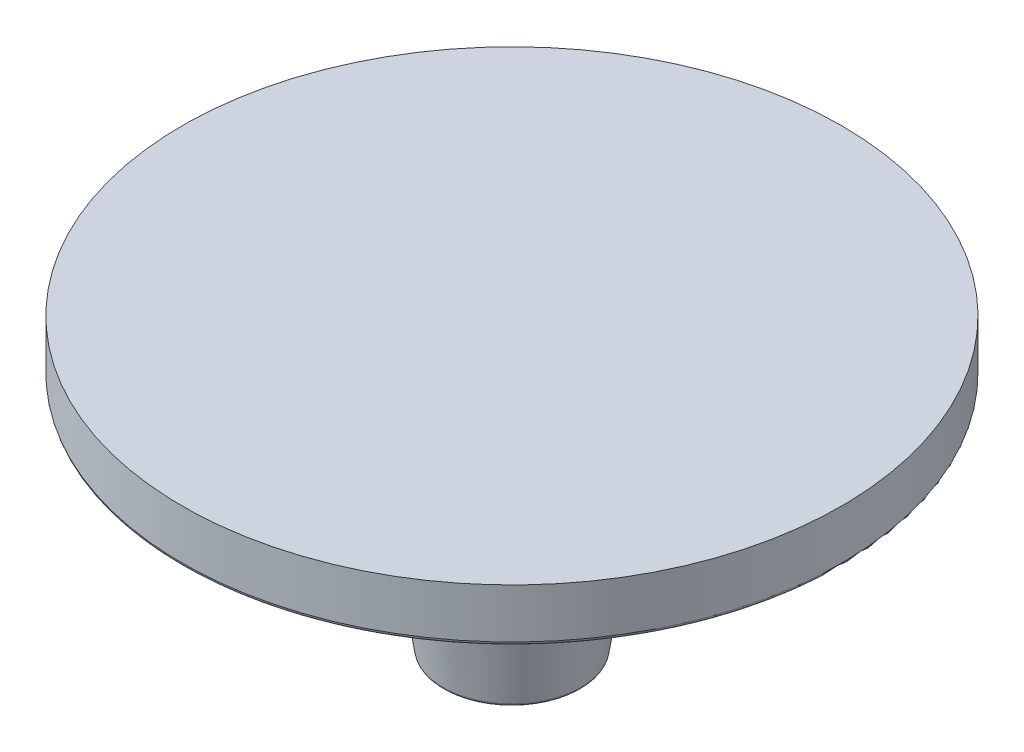
ISO-10303-21;
HEADER;
FILE_DESCRIPTION(('STEP AP214'),'2;1');
FILE_NAME('part.step','',(''),(''),'','','');
FILE_SCHEMA(('AUTOMOTIVE_DESIGN { 1 0 10303 214 1 1 1 1 }'));
ENDSEC;
DATA;
#1=APPLICATION_CONTEXT('core data for automotive mechanical design processes');
#2=APPLICATION_PROTOCOL_DEFINITION('international standard','automotive_design',2000,#1);
#3=PRODUCT_CONTEXT('',#1,'mechanical');
#4=PRODUCT('Part','Part','',(#3));
#5=PRODUCT_RELATED_PRODUCT_CATEGORY('part','',(#4));
#6=PRODUCT_DEFINITION_FORMATION('','',#4);
#7=PRODUCT_DEFINITION_CONTEXT('part definition',#1,'design');
#8=PRODUCT_DEFINITION('design','',#6,#7);
#9=PRODUCT_DEFINITION_SHAPE('','',#8);
#10=(LENGTH_UNIT() NAMED_UNIT(*) SI_UNIT(.MILLI.,.METRE.));
#11=(NAMED_UNIT(*) PLANE_ANGLE_UNIT() SI_UNIT($,.RADIAN.));
#12=(NAMED_UNIT(*) SI_UNIT($,.STERADIAN.) SOLID_ANGLE_UNIT());
#13=UNCERTAINTY_MEASURE_WITH_UNIT(LENGTH_MEASURE(1.E-05),#10,'distance_accuracy_value','');
#14=(GEOMETRIC_REPRESENTATION_CONTEXT(3) GLOBAL_UNCERTAINTY_ASSIGNED_CONTEXT((#13)) GLOBAL_UNIT_ASSIGNED_CONTEXT((#10,
#11,#12)) REPRESENTATION_CONTEXT('',''));
#15=CARTESIAN_POINT('',(0.,0.,0.));
#16=DIRECTION('',(0.,0.,1.));
#17=DIRECTION('',(1.,0.,0.));
#18=AXIS2_PLACEMENT_3D('',#15,#16,#17);
#19=CARTESIAN_POINT('',(2.17249861726044,20.8674084902866,0.));
#20=DIRECTION('',(0.,-1.,0.));
#21=DIRECTION('',(0.,0.,-1.));
#22=AXIS2_PLACEMENT_3D('',#19,#20,#21);
#23=PLANE('',#22);
#24=CARTESIAN_POINT('',(0.,20.8674084902866,0.));
#25=DIRECTION('',(0.,-1.,0.));
#26=DIRECTION('',(0.,0.,-1.));
#27=AXIS2_PLACEMENT_3D('',#24,#25,#26);
#28=CIRCLE('',#27,2.17249861726044);
#29=CARTESIAN_POINT('',(0.,20.8674084902866,-2.17249861726044));
#30=VERTEX_POINT('',#29);
#31=EDGE_CURVE('E10',#30,#30,#28,.T.);
#32=ORIENTED_EDGE('',*,*,#31,.T.);
#33=EDGE_LOOP('',(#32));
#34=FACE_BOUND('',#33,.T.);
#35=ADVANCED_FACE('F35',(#34),#23,.T.);
#36=CARTESIAN_POINT('',(0.,20.6174084902866,0.));
#37=DIRECTION('',(0.,-1.,0.));
#38=DIRECTION('',(0.,0.,-1.));
#39=AXIS2_PLACEMENT_3D('',#36,#37,#38);
#40=TOROIDAL_SURFACE('',#39,2.17249861726044,0.25);
#41=CARTESIAN_POINT('',(0.,20.6409149980165,0.));
#42=DIRECTION('',(0.,-1.,0.));
#43=DIRECTION('',(0.,0.,-1.));
#44=AXIS2_PLACEMENT_3D('',#41,#42,#43);
#45=CIRCLE('',#44,2.42139105204773);
#46=CARTESIAN_POINT('',(0.,20.6409149980165,-2.42139105204773));
#47=VERTEX_POINT('',#46);
#48=EDGE_CURVE('E41',#47,#47,#45,.T.);
#49=ORIENTED_EDGE('',*,*,#48,.T.);
#50=EDGE_LOOP('',(#49));
#51=FACE_BOUND('',#50,.T.);
#52=ORIENTED_EDGE('',*,*,#31,.F.);
#53=EDGE_LOOP('',(#52));
#54=FACE_BOUND('',#53,.T.);
#55=ADVANCED_FACE('F100',(#51,#54),#40,.F.);
#56=CARTESIAN_POINT('',(0.,20.6409149980165,0.));
#57=DIRECTION('',(0.,-1.,0.));
#58=DIRECTION('',(0.,0.,-1.));
#59=AXIS2_PLACEMENT_3D('',#56,#57,#58);
#60=CONICAL_SURFACE('',#59,2.42139105204773,0.0941651307315087);
#61=CARTESIAN_POINT('',(0.,12.0939019825567,0.));
#62=DIRECTION('',(0.,-1.,0.));
#63=DIRECTION('',(0.,0.,-1.));
#64=AXIS2_PLACEMENT_3D('',#61,#62,#63);
#65=CIRCLE('',#64,3.22860894795227);
#66=CARTESIAN_POINT('',(0.,12.0939019825567,-3.22860894795227));
#67=VERTEX_POINT('',#66);
#68=EDGE_CURVE('E45',#67,#67,#65,.T.);
#69=ORIENTED_EDGE('',*,*,#68,.T.);
#70=EDGE_LOOP('',(#69));
#71=FACE_BOUND('',#70,.T.);
#72=ORIENTED_EDGE('',*,*,#48,.F.);
#73=EDGE_LOOP('',(#72));
#74=FACE_BOUND('',#73,.T.);
#75=ADVANCED_FACE('F104',(#71,#74),#60,.F.);
#76=CARTESIAN_POINT('',(0.,12.1174084902866,0.));
#77=DIRECTION('',(0.,-1.,0.));
#78=DIRECTION('',(0.,0.,-1.));
#79=AXIS2_PLACEMENT_3D('',#76,#77,#78);
#80=TOROIDAL_SURFACE('',#79,3.47750138273956,0.249999999999998);
#81=CARTESIAN_POINT('',(0.,11.8674084902866,0.));
#82=DIRECTION('',(0.,-1.,0.));
#83=DIRECTION('',(0.,0.,-1.));
#84=AXIS2_PLACEMENT_3D('',#81,#82,#83);
#85=CIRCLE('',#84,3.47750138273956);
#86=CARTESIAN_POINT('',(0.,11.8674084902866,-3.47750138273956));
#87=VERTEX_POINT('',#86);
#88=EDGE_CURVE('E49',#87,#87,#85,.T.);
#89=ORIENTED_EDGE('',*,*,#88,.T.);
#90=EDGE_LOOP('',(#89));
#91=FACE_BOUND('',#90,.T.);
#92=ORIENTED_EDGE('',*,*,#68,.F.);
#93=EDGE_LOOP('',(#92));
#94=FACE_BOUND('',#93,.T.);
#95=ADVANCED_FACE('F108',(#91,#94),#80,.T.);
#96=CARTESIAN_POINT('',(4.98134627017547,11.8674084902866,0.));
#97=DIRECTION('',(0.,-1.,0.));
#98=DIRECTION('',(0.,0.,-1.));
#99=AXIS2_PLACEMENT_3D('',#96,#97,#98);
#100=PLANE('',#99);
#101=CARTESIAN_POINT('',(0.,11.8674084902866,0.));
#102=DIRECTION('',(0.,-1.,0.));
#103=DIRECTION('',(0.,0.,-1.));
#104=AXIS2_PLACEMENT_3D('',#101,#102,#103);
#105=CIRCLE('',#104,4.98134627017547);
#106=CARTESIAN_POINT('',(0.,11.8674084902866,-4.98134627017547));
#107=VERTEX_POINT('',#106);
#108=EDGE_CURVE('E54',#107,#107,#105,.T.);
#109=ORIENTED_EDGE('',*,*,#108,.T.);
#110=EDGE_LOOP('',(#109));
#111=FACE_BOUND('',#110,.T.);
#112=ORIENTED_EDGE('',*,*,#88,.F.);
#113=EDGE_LOOP('',(#112));
#114=FACE_BOUND('',#113,.T.);
#115=ADVANCED_FACE('F115',(#111,#114),#100,.T.);
#116=CARTESIAN_POINT('',(0.,12.1174084902866,0.));
#117=DIRECTION('',(0.,-1.,0.));
#118=DIRECTION('',(0.,0.,-1.));
#119=AXIS2_PLACEMENT_3D('',#116,#117,#118);
#120=TOROIDAL_SURFACE('',#119,4.98134627017547,0.249999999999998);
#121=CARTESIAN_POINT('',(0.,12.0805144775116,0.));
#122=DIRECTION('',(0.,-1.,0.));
#123=DIRECTION('',(0.,0.,-1.));
#124=AXIS2_PLACEMENT_3D('',#121,#122,#123);
#125=CIRCLE('',#124,5.22860894795227);
#126=CARTESIAN_POINT('',(0.,12.0805144775116,-5.22860894795227));
#127=VERTEX_POINT('',#126);
#128=EDGE_CURVE('E57',#127,#127,#125,.T.);
#129=ORIENTED_EDGE('',*,*,#128,.T.);
#130=EDGE_LOOP('',(#129));
#131=FACE_BOUND('',#130,.T.);
#132=ORIENTED_EDGE('',*,*,#108,.F.);
#133=EDGE_LOOP('',(#132));
#134=FACE_BOUND('',#133,.T.);
#135=ADVANCED_FACE('F119',(#131,#134),#120,.T.);
#136=CARTESIAN_POINT('',(0.,12.0805144775116,0.));
#137=DIRECTION('',(0.,1.,0.));
#138=DIRECTION('',(0.,0.,1.));
#139=AXIS2_PLACEMENT_3D('',#136,#137,#138);
#140=CONICAL_SURFACE('',#139,5.22860894795227,0.148117038821715);
#141=CARTESIAN_POINT('',(0.,30.6543025030617,0.));
#142=DIRECTION('',(0.,-1.,0.));
#143=DIRECTION('',(0.,0.,-1.));
#144=AXIS2_PLACEMENT_3D('',#141,#142,#143);
#145=CIRCLE('',#144,8.);
#146=CARTESIAN_POINT('',(0.,30.6543025030617,-8.));
#147=VERTEX_POINT('',#146);
#148=EDGE_CURVE('E60',#147,#147,#145,.T.);
#149=ORIENTED_EDGE('',*,*,#148,.T.);
#150=EDGE_LOOP('',(#149));
#151=FACE_BOUND('',#150,.T.);
#152=ORIENTED_EDGE('',*,*,#128,.F.);
#153=EDGE_LOOP('',(#152));
#154=FACE_BOUND('',#153,.T.);
#155=ADVANCED_FACE('F123',(#151,#154),#140,.T.);
#156=CARTESIAN_POINT('',(0.,30.6174084902866,0.));
#157=DIRECTION('',(0.,-1.,0.));
#158=DIRECTION('',(0.,0.,-1.));
#159=AXIS2_PLACEMENT_3D('',#156,#157,#158);
#160=TOROIDAL_SURFACE('',#159,8.2472626777768,0.25);
#161=CARTESIAN_POINT('',(0.,30.8674084902866,0.));
#162=DIRECTION('',(0.,-1.,0.));
#163=DIRECTION('',(0.,0.,-1.));
#164=AXIS2_PLACEMENT_3D('',#161,#162,#163);
#165=CIRCLE('',#164,8.2472626777768);
#166=CARTESIAN_POINT('',(0.,30.8674084902866,-8.2472626777768));
#167=VERTEX_POINT('',#166);
#168=EDGE_CURVE('E63',#167,#167,#165,.T.);
#169=ORIENTED_EDGE('',*,*,#168,.T.);
#170=EDGE_LOOP('',(#169));
#171=FACE_BOUND('',#170,.T.);
#172=ORIENTED_EDGE('',*,*,#148,.F.);
#173=EDGE_LOOP('',(#172));
#174=FACE_BOUND('',#173,.T.);
#175=ADVANCED_FACE('F127',(#171,#174),#160,.F.);
#176=CARTESIAN_POINT('',(22.75,30.8674084902866,0.));
#177=DIRECTION('',(0.,-1.,0.));
#178=DIRECTION('',(0.,0.,-1.));
#179=AXIS2_PLACEMENT_3D('',#176,#177,#178);
#180=PLANE('',#179);
#181=CARTESIAN_POINT('',(0.,30.8674084902866,0.));
#182=DIRECTION('',(0.,-1.,0.));
#183=DIRECTION('',(0.,0.,-1.));
#184=AXIS2_PLACEMENT_3D('',#181,#182,#183);
#185=CIRCLE('',#184,22.75);
#186=CARTESIAN_POINT('',(0.,30.8674084902866,-22.75));
#187=VERTEX_POINT('',#186);
#188=EDGE_CURVE('E66',#187,#187,#185,.T.);
#189=ORIENTED_EDGE('',*,*,#188,.T.);
#190=EDGE_LOOP('',(#189));
#191=FACE_BOUND('',#190,.T.);
#192=ORIENTED_EDGE('',*,*,#168,.F.);
#193=EDGE_LOOP('',(#192));
#194=FACE_BOUND('',#193,.T.);
#195=ADVANCED_FACE('F131',(#191,#194),#180,.T.);
#196=CARTESIAN_POINT('',(0.,30.6174084902866,0.));
#197=DIRECTION('',(0.,-1.,0.));
#198=DIRECTION('',(0.,0.,-1.));
#199=AXIS2_PLACEMENT_3D('',#196,#197,#198);
#200=TOROIDAL_SURFACE('',#199,22.75,0.250000000000002);
#201=CARTESIAN_POINT('',(0.,30.6174084902866,0.));
#202=DIRECTION('',(0.,-1.,0.));
#203=DIRECTION('',(0.,0.,-1.));
#204=AXIS2_PLACEMENT_3D('',#201,#202,#203);
#205=CIRCLE('',#204,23.);
#206=CARTESIAN_POINT('',(0.,30.6174084902866,-23.));
#207=VERTEX_POINT('',#206);
#208=EDGE_CURVE('E69',#207,#207,#205,.T.);
#209=ORIENTED_EDGE('',*,*,#208,.T.);
#210=EDGE_LOOP('',(#209));
#211=FACE_BOUND('',#210,.T.);
#212=ORIENTED_EDGE('',*,*,#188,.F.);
#213=EDGE_LOOP('',(#212));
#214=FACE_BOUND('',#213,.T.);
#215=ADVANCED_FACE('F135',(#211,#214),#200,.F.);
#216=CARTESIAN_POINT('',(0.,20.8674084902866,0.));
#217=DIRECTION('',(0.,-1.,0.));
#218=DIRECTION('',(0.,0.,-1.));
#219=AXIS2_PLACEMENT_3D('',#216,#217,#218);
#220=CYLINDRICAL_SURFACE('',#219,23.);
#221=CARTESIAN_POINT('',(0.,30.1174084902866,0.));
#222=DIRECTION('',(0.,-1.,0.));
#223=DIRECTION('',(0.,0.,-1.));
#224=AXIS2_PLACEMENT_3D('',#221,#222,#223);
#225=CIRCLE('',#224,23.);
#226=CARTESIAN_POINT('',(0.,30.1174084902866,-23.));
#227=VERTEX_POINT('',#226);
#228=EDGE_CURVE('E72',#227,#227,#225,.T.);
#229=ORIENTED_EDGE('',*,*,#228,.T.);
#230=EDGE_LOOP('',(#229));
#231=FACE_BOUND('',#230,.T.);
#232=ORIENTED_EDGE('',*,*,#208,.F.);
#233=EDGE_LOOP('',(#232));
#234=FACE_BOUND('',#233,.T.);
#235=ADVANCED_FACE('F139',(#231,#234),#220,.F.);
#236=CARTESIAN_POINT('',(0.,30.1174084902866,0.));
#237=DIRECTION('',(0.,-1.,0.));
#238=DIRECTION('',(0.,0.,-1.));
#239=AXIS2_PLACEMENT_3D('',#236,#237,#238);
#240=TOROIDAL_SURFACE('',#239,23.25,0.249999999999997);
#241=CARTESIAN_POINT('',(0.,29.8674084902866,0.));
#242=DIRECTION('',(0.,-1.,0.));
#243=DIRECTION('',(0.,0.,-1.));
#244=AXIS2_PLACEMENT_3D('',#241,#242,#243);
#245=CIRCLE('',#244,23.25);
#246=CARTESIAN_POINT('',(0.,29.8674084902866,-23.25));
#247=VERTEX_POINT('',#246);
#248=EDGE_CURVE('E75',#247,#247,#245,.T.);
#249=ORIENTED_EDGE('',*,*,#248,.T.);
#250=EDGE_LOOP('',(#249));
#251=FACE_BOUND('',#250,.T.);
#252=ORIENTED_EDGE('',*,*,#228,.F.);
#253=EDGE_LOOP('',(#252));
#254=FACE_BOUND('',#253,.T.);
#255=ADVANCED_FACE('F143',(#251,#254),#240,.T.);
#256=CARTESIAN_POINT('',(23.25,29.8674084902866,0.));
#257=DIRECTION('',(0.,-1.,0.));
#258=DIRECTION('',(0.,0.,-1.));
#259=AXIS2_PLACEMENT_3D('',#256,#257,#258);
#260=PLANE('',#259);
#261=CARTESIAN_POINT('',(0.,29.8674084902866,0.));
#262=DIRECTION('',(0.,-1.,0.));
#263=DIRECTION('',(0.,0.,-1.));
#264=AXIS2_PLACEMENT_3D('',#261,#262,#263);
#265=CIRCLE('',#264,24.75);
#266=CARTESIAN_POINT('',(0.,29.8674084902866,-24.75));
#267=VERTEX_POINT('',#266);
#268=EDGE_CURVE('E78',#267,#267,#265,.T.);
#269=ORIENTED_EDGE('',*,*,#268,.T.);
#270=EDGE_LOOP('',(#269));
#271=FACE_BOUND('',#270,.T.);
#272=ORIENTED_EDGE('',*,*,#248,.F.);
#273=EDGE_LOOP('',(#272));
#274=FACE_BOUND('',#273,.T.);
#275=ADVANCED_FACE('F147',(#271,#274),#260,.T.);
#276=CARTESIAN_POINT('',(0.,30.1174084902866,0.));
#277=DIRECTION('',(0.,-1.,0.));
#278=DIRECTION('',(0.,0.,-1.));
#279=AXIS2_PLACEMENT_3D('',#276,#277,#278);
#280=TOROIDAL_SURFACE('',#279,24.75,0.25);
#281=CARTESIAN_POINT('',(0.,30.1174084902866,0.));
#282=DIRECTION('',(0.,-1.,0.));
#283=DIRECTION('',(0.,0.,-1.));
#284=AXIS2_PLACEMENT_3D('',#281,#282,#283);
#285=CIRCLE('',#284,25.);
#286=CARTESIAN_POINT('',(0.,30.1174084902866,-25.));
#287=VERTEX_POINT('',#286);
#288=EDGE_CURVE('E81',#287,#287,#285,.T.);
#289=ORIENTED_EDGE('',*,*,#288,.T.);
#290=EDGE_LOOP('',(#289));
#291=FACE_BOUND('',#290,.T.);
#292=ORIENTED_EDGE('',*,*,#268,.F.);
#293=EDGE_LOOP('',(#292));
#294=FACE_BOUND('',#293,.T.);
#295=ADVANCED_FACE('F97',(#291,#294),#280,.T.);
#296=CARTESIAN_POINT('',(0.,20.8674084902866,0.));
#297=DIRECTION('',(0.,-1.,0.));
#298=DIRECTION('',(0.,0.,-1.));
#299=AXIS2_PLACEMENT_3D('',#296,#297,#298);
#300=CYLINDRICAL_SURFACE('',#299,25.);
#301=CARTESIAN_POINT('',(0.,33.8674084902866,0.));
#302=DIRECTION('',(0.,-1.,0.));
#303=DIRECTION('',(0.,0.,-1.));
#304=AXIS2_PLACEMENT_3D('',#301,#302,#303);
#305=CIRCLE('',#304,25.);
#306=CARTESIAN_POINT('',(0.,33.8674084902866,-25.));
#307=VERTEX_POINT('',#306);
#308=EDGE_CURVE('E84',#307,#307,#305,.T.);
#309=ORIENTED_EDGE('',*,*,#308,.T.);
#310=EDGE_LOOP('',(#309));
#311=FACE_BOUND('',#310,.T.);
#312=ORIENTED_EDGE('',*,*,#288,.F.);
#313=EDGE_LOOP('',(#312));
#314=FACE_BOUND('',#313,.T.);
#315=ADVANCED_FACE('F88',(#311,#314),#300,.T.);
#316=CARTESIAN_POINT('',(0.,33.8674084902866,0.));
#317=DIRECTION('',(0.,1.,0.));
#318=DIRECTION('',(0.,0.,1.));
#319=AXIS2_PLACEMENT_3D('',#316,#317,#318);
#320=PLANE('',#319);
#321=ORIENTED_EDGE('',*,*,#308,.F.);
#322=EDGE_LOOP('',(#321));
#323=FACE_BOUND('',#322,.T.);
#324=ADVANCED_FACE('F91',(#323),#320,.T.);
#325=CLOSED_SHELL('',(#35,#55,#75,#95,#115,#135,#155,#175,#195,#215,#235,#255,#275,#295,#315,#324));
#326=MANIFOLD_SOLID_BREP('B2',#325);
#327=ADVANCED_BREP_SHAPE_REPRESENTATION('',(#18,#326),#14);
#328=SHAPE_DEFINITION_REPRESENTATION(#9,#327);
ENDSEC;
END-ISO-10303-21;
